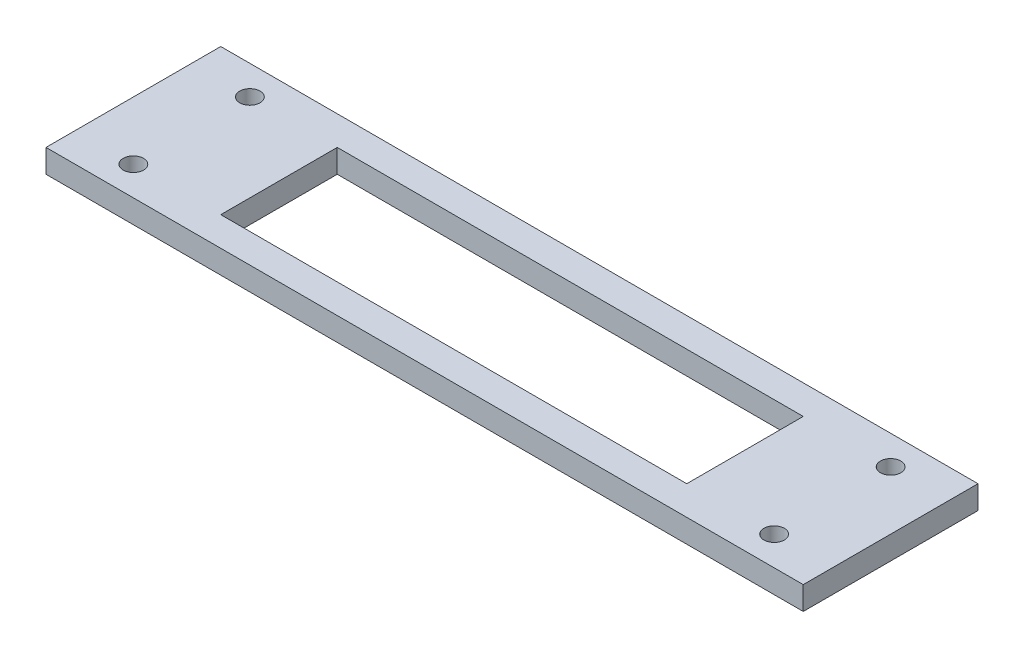
ISO-10303-21;
HEADER;
FILE_DESCRIPTION(('STEP AP214'),'2;1');
FILE_NAME('part.step','',(''),(''),'','','');
FILE_SCHEMA(('AUTOMOTIVE_DESIGN { 1 0 10303 214 1 1 1 1 }'));
ENDSEC;
DATA;
#1=APPLICATION_CONTEXT('core data for automotive mechanical design processes');
#2=APPLICATION_PROTOCOL_DEFINITION('international standard','automotive_design',2000,#1);
#3=PRODUCT_CONTEXT('',#1,'mechanical');
#4=PRODUCT('Part','Part','',(#3));
#5=PRODUCT_RELATED_PRODUCT_CATEGORY('part','',(#4));
#6=PRODUCT_DEFINITION_FORMATION('','',#4);
#7=PRODUCT_DEFINITION_CONTEXT('part definition',#1,'design');
#8=PRODUCT_DEFINITION('design','',#6,#7);
#9=PRODUCT_DEFINITION_SHAPE('','',#8);
#10=(LENGTH_UNIT() NAMED_UNIT(*) SI_UNIT(.MILLI.,.METRE.));
#11=(NAMED_UNIT(*) PLANE_ANGLE_UNIT() SI_UNIT($,.RADIAN.));
#12=(NAMED_UNIT(*) SI_UNIT($,.STERADIAN.) SOLID_ANGLE_UNIT());
#13=UNCERTAINTY_MEASURE_WITH_UNIT(LENGTH_MEASURE(1.E-05),#10,'distance_accuracy_value','');
#14=(GEOMETRIC_REPRESENTATION_CONTEXT(3) GLOBAL_UNCERTAINTY_ASSIGNED_CONTEXT((#13)) GLOBAL_UNIT_ASSIGNED_CONTEXT((#10,
#11,#12)) REPRESENTATION_CONTEXT('',''));
#15=CARTESIAN_POINT('',(0.,0.,0.));
#16=DIRECTION('',(0.,0.,1.));
#17=DIRECTION('',(1.,0.,0.));
#18=AXIS2_PLACEMENT_3D('',#15,#16,#17);
#19=CARTESIAN_POINT('',(0.,4.,0.));
#20=DIRECTION('',(-1.,0.,0.));
#21=DIRECTION('',(0.,0.,1.));
#22=AXIS2_PLACEMENT_3D('',#19,#20,#21);
#23=PLANE('',#22);
#24=DIRECTION('',(0.,0.,-1.));
#25=VECTOR('',#24,1.);
#26=CARTESIAN_POINT('',(0.,0.,0.));
#27=LINE('',#26,#25);
#28=CARTESIAN_POINT('',(0.,0.,0.));
#29=VERTEX_POINT('',#28);
#30=CARTESIAN_POINT('',(0.,0.,-30.));
#31=VERTEX_POINT('',#30);
#32=EDGE_CURVE('E133',#29,#31,#27,.T.);
#33=ORIENTED_EDGE('',*,*,#32,.F.);
#34=DIRECTION('',(0.,-1.,0.));
#35=VECTOR('',#34,1.);
#36=CARTESIAN_POINT('',(0.,4.,0.));
#37=LINE('',#36,#35);
#38=CARTESIAN_POINT('',(0.,4.,0.));
#39=VERTEX_POINT('',#38);
#40=EDGE_CURVE('E11',#39,#29,#37,.T.);
#41=ORIENTED_EDGE('',*,*,#40,.F.);
#42=DIRECTION('',(0.,0.,-1.));
#43=VECTOR('',#42,1.);
#44=CARTESIAN_POINT('',(0.,4.,0.));
#45=LINE('',#44,#43);
#46=CARTESIAN_POINT('',(0.,4.,-30.));
#47=VERTEX_POINT('',#46);
#48=EDGE_CURVE('E137',#39,#47,#45,.T.);
#49=ORIENTED_EDGE('',*,*,#48,.T.);
#50=DIRECTION('',(0.,-1.,0.));
#51=VECTOR('',#50,1.);
#52=CARTESIAN_POINT('',(0.,4.,-30.));
#53=LINE('',#52,#51);
#54=EDGE_CURVE('E160',#47,#31,#53,.T.);
#55=ORIENTED_EDGE('',*,*,#54,.T.);
#56=EDGE_LOOP('',(#33,#41,#49,#55));
#57=FACE_BOUND('',#56,.T.);
#58=ADVANCED_FACE('F37',(#57),#23,.T.);
#59=CARTESIAN_POINT('',(0.,4.,0.));
#60=DIRECTION('',(0.,0.,-1.));
#61=DIRECTION('',(-1.,0.,0.));
#62=AXIS2_PLACEMENT_3D('',#59,#60,#61);
#63=PLANE('',#62);
#64=DIRECTION('',(1.,0.,0.));
#65=VECTOR('',#64,1.);
#66=CARTESIAN_POINT('',(0.,0.,0.));
#67=LINE('',#66,#65);
#68=CARTESIAN_POINT('',(130.,0.,0.));
#69=VERTEX_POINT('',#68);
#70=EDGE_CURVE('E163',#29,#69,#67,.T.);
#71=ORIENTED_EDGE('',*,*,#70,.T.);
#72=DIRECTION('',(0.,-1.,0.));
#73=VECTOR('',#72,1.);
#74=CARTESIAN_POINT('',(130.,4.,0.));
#75=LINE('',#74,#73);
#76=CARTESIAN_POINT('',(130.,4.,0.));
#77=VERTEX_POINT('',#76);
#78=EDGE_CURVE('E44',#77,#69,#75,.T.);
#79=ORIENTED_EDGE('',*,*,#78,.F.);
#80=DIRECTION('',(1.,0.,0.));
#81=VECTOR('',#80,1.);
#82=CARTESIAN_POINT('',(0.,4.,0.));
#83=LINE('',#82,#81);
#84=EDGE_CURVE('E140',#39,#77,#83,.T.);
#85=ORIENTED_EDGE('',*,*,#84,.F.);
#86=ORIENTED_EDGE('',*,*,#40,.T.);
#87=EDGE_LOOP('',(#71,#79,#85,#86));
#88=FACE_BOUND('',#87,.T.);
#89=ADVANCED_FACE('F204',(#88),#63,.F.);
#90=CARTESIAN_POINT('',(130.,4.,0.));
#91=DIRECTION('',(-1.,0.,0.));
#92=DIRECTION('',(0.,0.,1.));
#93=AXIS2_PLACEMENT_3D('',#90,#91,#92);
#94=PLANE('',#93);
#95=DIRECTION('',(0.,0.,-1.));
#96=VECTOR('',#95,1.);
#97=CARTESIAN_POINT('',(130.,0.,0.));
#98=LINE('',#97,#96);
#99=CARTESIAN_POINT('',(130.,0.,-30.));
#100=VERTEX_POINT('',#99);
#101=EDGE_CURVE('E165',#69,#100,#98,.T.);
#102=ORIENTED_EDGE('',*,*,#101,.T.);
#103=DIRECTION('',(0.,-1.,0.));
#104=VECTOR('',#103,1.);
#105=CARTESIAN_POINT('',(130.,4.,-30.));
#106=LINE('',#105,#104);
#107=CARTESIAN_POINT('',(130.,4.,-30.));
#108=VERTEX_POINT('',#107);
#109=EDGE_CURVE('E183',#108,#100,#106,.T.);
#110=ORIENTED_EDGE('',*,*,#109,.F.);
#111=DIRECTION('',(0.,0.,-1.));
#112=VECTOR('',#111,1.);
#113=CARTESIAN_POINT('',(130.,4.,0.));
#114=LINE('',#113,#112);
#115=EDGE_CURVE('E143',#77,#108,#114,.T.);
#116=ORIENTED_EDGE('',*,*,#115,.F.);
#117=ORIENTED_EDGE('',*,*,#78,.T.);
#118=EDGE_LOOP('',(#102,#110,#116,#117));
#119=FACE_BOUND('',#118,.T.);
#120=ADVANCED_FACE('F189',(#119),#94,.F.);
#121=CARTESIAN_POINT('',(9.99999999999999,4.,-5.));
#122=DIRECTION('',(0.,-1.,0.));
#123=DIRECTION('',(0.,0.,-1.));
#124=AXIS2_PLACEMENT_3D('',#121,#122,#123);
#125=CYLINDRICAL_SURFACE('',#124,1.75000000000001);
#126=CARTESIAN_POINT('',(9.99999999999999,4.,-5.));
#127=DIRECTION('',(0.,1.,0.));
#128=DIRECTION('',(0.,0.,1.));
#129=AXIS2_PLACEMENT_3D('',#126,#127,#128);
#130=CIRCLE('',#129,1.75000000000001);
#131=CARTESIAN_POINT('',(9.99999999999999,4.,-3.24999999999999));
#132=VERTEX_POINT('',#131);
#133=EDGE_CURVE('E154',#132,#132,#130,.F.);
#134=ORIENTED_EDGE('',*,*,#133,.F.);
#135=EDGE_LOOP('',(#134));
#136=FACE_BOUND('',#135,.T.);
#137=CARTESIAN_POINT('',(9.99999999999999,0.,-5.));
#138=DIRECTION('',(0.,1.,0.));
#139=DIRECTION('',(0.,0.,1.));
#140=AXIS2_PLACEMENT_3D('',#137,#138,#139);
#141=CIRCLE('',#140,1.75000000000001);
#142=CARTESIAN_POINT('',(9.99999999999999,0.,-3.24999999999999));
#143=VERTEX_POINT('',#142);
#144=EDGE_CURVE('E177',#143,#143,#141,.F.);
#145=ORIENTED_EDGE('',*,*,#144,.T.);
#146=EDGE_LOOP('',(#145));
#147=FACE_BOUND('',#146,.T.);
#148=ADVANCED_FACE('F213',(#136,#147),#125,.F.);
#149=CARTESIAN_POINT('',(120.,4.,-25.));
#150=DIRECTION('',(0.,-1.,0.));
#151=DIRECTION('',(0.,0.,-1.));
#152=AXIS2_PLACEMENT_3D('',#149,#150,#151);
#153=CYLINDRICAL_SURFACE('',#152,1.75000000000001);
#154=CARTESIAN_POINT('',(120.,4.,-25.));
#155=DIRECTION('',(0.,1.,0.));
#156=DIRECTION('',(0.,0.,1.));
#157=AXIS2_PLACEMENT_3D('',#154,#155,#156);
#158=CIRCLE('',#157,1.75000000000001);
#159=CARTESIAN_POINT('',(120.,4.,-23.25));
#160=VERTEX_POINT('',#159);
#161=EDGE_CURVE('E151',#160,#160,#158,.T.);
#162=ORIENTED_EDGE('',*,*,#161,.T.);
#163=EDGE_LOOP('',(#162));
#164=FACE_BOUND('',#163,.T.);
#165=CARTESIAN_POINT('',(120.,0.,-25.));
#166=DIRECTION('',(0.,1.,0.));
#167=DIRECTION('',(0.,0.,1.));
#168=AXIS2_PLACEMENT_3D('',#165,#166,#167);
#169=CIRCLE('',#168,1.75000000000001);
#170=CARTESIAN_POINT('',(120.,0.,-23.25));
#171=VERTEX_POINT('',#170);
#172=EDGE_CURVE('E174',#171,#171,#169,.T.);
#173=ORIENTED_EDGE('',*,*,#172,.F.);
#174=EDGE_LOOP('',(#173));
#175=FACE_BOUND('',#174,.T.);
#176=ADVANCED_FACE('F222',(#164,#175),#153,.F.);
#177=CARTESIAN_POINT('',(9.99999999999999,4.,-25.));
#178=DIRECTION('',(0.,-1.,0.));
#179=DIRECTION('',(0.,0.,-1.));
#180=AXIS2_PLACEMENT_3D('',#177,#178,#179);
#181=CYLINDRICAL_SURFACE('',#180,1.75000000000001);
#182=CARTESIAN_POINT('',(9.99999999999999,4.,-25.));
#183=DIRECTION('',(0.,1.,0.));
#184=DIRECTION('',(0.,0.,1.));
#185=AXIS2_PLACEMENT_3D('',#182,#183,#184);
#186=CIRCLE('',#185,1.75000000000001);
#187=CARTESIAN_POINT('',(9.99999999999999,4.,-23.25));
#188=VERTEX_POINT('',#187);
#189=EDGE_CURVE('E148',#188,#188,#186,.F.);
#190=ORIENTED_EDGE('',*,*,#189,.F.);
#191=EDGE_LOOP('',(#190));
#192=FACE_BOUND('',#191,.T.);
#193=CARTESIAN_POINT('',(9.99999999999999,0.,-25.));
#194=DIRECTION('',(0.,1.,0.));
#195=DIRECTION('',(0.,0.,1.));
#196=AXIS2_PLACEMENT_3D('',#193,#194,#195);
#197=CIRCLE('',#196,1.75000000000001);
#198=CARTESIAN_POINT('',(9.99999999999999,0.,-23.25));
#199=VERTEX_POINT('',#198);
#200=EDGE_CURVE('E171',#199,#199,#197,.F.);
#201=ORIENTED_EDGE('',*,*,#200,.T.);
#202=EDGE_LOOP('',(#201));
#203=FACE_BOUND('',#202,.T.);
#204=ADVANCED_FACE('F219',(#192,#203),#181,.F.);
#205=CARTESIAN_POINT('',(0.,4.,-30.));
#206=DIRECTION('',(0.,0.,-1.));
#207=DIRECTION('',(-1.,0.,0.));
#208=AXIS2_PLACEMENT_3D('',#205,#206,#207);
#209=PLANE('',#208);
#210=DIRECTION('',(1.,0.,0.));
#211=VECTOR('',#210,1.);
#212=CARTESIAN_POINT('',(0.,0.,-30.));
#213=LINE('',#212,#211);
#214=EDGE_CURVE('E168',#31,#100,#213,.T.);
#215=ORIENTED_EDGE('',*,*,#214,.F.);
#216=ORIENTED_EDGE('',*,*,#54,.F.);
#217=DIRECTION('',(1.,0.,0.));
#218=VECTOR('',#217,1.);
#219=CARTESIAN_POINT('',(0.,4.,-30.));
#220=LINE('',#219,#218);
#221=EDGE_CURVE('E145',#47,#108,#220,.T.);
#222=ORIENTED_EDGE('',*,*,#221,.T.);
#223=ORIENTED_EDGE('',*,*,#109,.T.);
#224=EDGE_LOOP('',(#215,#216,#222,#223));
#225=FACE_BOUND('',#224,.T.);
#226=ADVANCED_FACE('F198',(#225),#209,.T.);
#227=CARTESIAN_POINT('',(120.,4.,-5.));
#228=DIRECTION('',(0.,-1.,0.));
#229=DIRECTION('',(0.,0.,-1.));
#230=AXIS2_PLACEMENT_3D('',#227,#228,#229);
#231=CYLINDRICAL_SURFACE('',#230,1.75000000000001);
#232=CARTESIAN_POINT('',(120.,4.,-5.));
#233=DIRECTION('',(0.,1.,0.));
#234=DIRECTION('',(0.,0.,1.));
#235=AXIS2_PLACEMENT_3D('',#232,#233,#234);
#236=CIRCLE('',#235,1.75000000000001);
#237=CARTESIAN_POINT('',(120.,4.,-3.24999999999999));
#238=VERTEX_POINT('',#237);
#239=EDGE_CURVE('E157',#238,#238,#236,.T.);
#240=ORIENTED_EDGE('',*,*,#239,.T.);
#241=EDGE_LOOP('',(#240));
#242=FACE_BOUND('',#241,.T.);
#243=CARTESIAN_POINT('',(120.,0.,-5.));
#244=DIRECTION('',(0.,1.,0.));
#245=DIRECTION('',(0.,0.,1.));
#246=AXIS2_PLACEMENT_3D('',#243,#244,#245);
#247=CIRCLE('',#246,1.75000000000001);
#248=CARTESIAN_POINT('',(120.,0.,-3.24999999999999));
#249=VERTEX_POINT('',#248);
#250=EDGE_CURVE('E141',#249,#249,#247,.T.);
#251=ORIENTED_EDGE('',*,*,#250,.F.);
#252=EDGE_LOOP('',(#251));
#253=FACE_BOUND('',#252,.T.);
#254=ADVANCED_FACE('F218',(#242,#253),#231,.F.);
#255=CARTESIAN_POINT('',(0.,4.,0.));
#256=DIRECTION('',(0.,1.,0.));
#257=DIRECTION('',(0.,0.,1.));
#258=AXIS2_PLACEMENT_3D('',#255,#256,#257);
#259=PLANE('',#258);
#260=DIRECTION('',(0.,0.,1.));
#261=VECTOR('',#260,1.);
#262=CARTESIAN_POINT('',(25.,4.,-25.));
#263=LINE('',#262,#261);
#264=CARTESIAN_POINT('',(25.,4.,-25.));
#265=VERTEX_POINT('',#264);
#266=CARTESIAN_POINT('',(25.,4.,-5.));
#267=VERTEX_POINT('',#266);
#268=EDGE_CURVE('E51',#265,#267,#263,.T.);
#269=ORIENTED_EDGE('',*,*,#268,.F.);
#270=DIRECTION('',(-1.,0.,0.));
#271=VECTOR('',#270,1.);
#272=CARTESIAN_POINT('',(25.,4.,-25.));
#273=LINE('',#272,#271);
#274=CARTESIAN_POINT('',(105.,4.,-25.));
#275=VERTEX_POINT('',#274);
#276=EDGE_CURVE('E118',#275,#265,#273,.T.);
#277=ORIENTED_EDGE('',*,*,#276,.F.);
#278=DIRECTION('',(0.,0.,-1.));
#279=VECTOR('',#278,1.);
#280=CARTESIAN_POINT('',(105.,4.,-25.));
#281=LINE('',#280,#279);
#282=CARTESIAN_POINT('',(105.,4.,-5.));
#283=VERTEX_POINT('',#282);
#284=EDGE_CURVE('E121',#283,#275,#281,.T.);
#285=ORIENTED_EDGE('',*,*,#284,.F.);
#286=DIRECTION('',(1.,0.,0.));
#287=VECTOR('',#286,1.);
#288=CARTESIAN_POINT('',(25.,4.,-5.));
#289=LINE('',#288,#287);
#290=EDGE_CURVE('E127',#267,#283,#289,.T.);
#291=ORIENTED_EDGE('',*,*,#290,.F.);
#292=EDGE_LOOP('',(#269,#277,#285,#291));
#293=FACE_BOUND('',#292,.T.);
#294=ORIENTED_EDGE('',*,*,#48,.F.);
#295=ORIENTED_EDGE('',*,*,#84,.T.);
#296=ORIENTED_EDGE('',*,*,#115,.T.);
#297=ORIENTED_EDGE('',*,*,#221,.F.);
#298=EDGE_LOOP('',(#294,#295,#296,#297));
#299=FACE_BOUND('',#298,.T.);
#300=ORIENTED_EDGE('',*,*,#189,.T.);
#301=EDGE_LOOP('',(#300));
#302=FACE_BOUND('',#301,.T.);
#303=ORIENTED_EDGE('',*,*,#161,.F.);
#304=EDGE_LOOP('',(#303));
#305=FACE_BOUND('',#304,.T.);
#306=ORIENTED_EDGE('',*,*,#133,.T.);
#307=EDGE_LOOP('',(#306));
#308=FACE_BOUND('',#307,.T.);
#309=ORIENTED_EDGE('',*,*,#239,.F.);
#310=EDGE_LOOP('',(#309));
#311=FACE_BOUND('',#310,.T.);
#312=ADVANCED_FACE('F202',(#293,#299,#302,#305,#308,#311),#259,.T.);
#313=CARTESIAN_POINT('',(0.,0.,0.));
#314=DIRECTION('',(0.,1.,0.));
#315=DIRECTION('',(0.,0.,1.));
#316=AXIS2_PLACEMENT_3D('',#313,#314,#315);
#317=PLANE('',#316);
#318=DIRECTION('',(-1.,0.,0.));
#319=VECTOR('',#318,1.);
#320=CARTESIAN_POINT('',(25.,0.,-25.));
#321=LINE('',#320,#319);
#322=CARTESIAN_POINT('',(105.,0.,-25.));
#323=VERTEX_POINT('',#322);
#324=CARTESIAN_POINT('',(25.,0.,-25.));
#325=VERTEX_POINT('',#324);
#326=EDGE_CURVE('E108',#323,#325,#321,.T.);
#327=ORIENTED_EDGE('',*,*,#326,.T.);
#328=DIRECTION('',(0.,0.,1.));
#329=VECTOR('',#328,1.);
#330=CARTESIAN_POINT('',(25.,0.,-25.));
#331=LINE('',#330,#329);
#332=CARTESIAN_POINT('',(25.,0.,-5.));
#333=VERTEX_POINT('',#332);
#334=EDGE_CURVE('E102',#325,#333,#331,.T.);
#335=ORIENTED_EDGE('',*,*,#334,.T.);
#336=DIRECTION('',(1.,0.,0.));
#337=VECTOR('',#336,1.);
#338=CARTESIAN_POINT('',(25.,0.,-5.));
#339=LINE('',#338,#337);
#340=CARTESIAN_POINT('',(105.,0.,-5.));
#341=VERTEX_POINT('',#340);
#342=EDGE_CURVE('E111',#333,#341,#339,.T.);
#343=ORIENTED_EDGE('',*,*,#342,.T.);
#344=DIRECTION('',(0.,0.,-1.));
#345=VECTOR('',#344,1.);
#346=CARTESIAN_POINT('',(105.,0.,-25.));
#347=LINE('',#346,#345);
#348=EDGE_CURVE('E59',#341,#323,#347,.T.);
#349=ORIENTED_EDGE('',*,*,#348,.T.);
#350=EDGE_LOOP('',(#327,#335,#343,#349));
#351=FACE_BOUND('',#350,.T.);
#352=ORIENTED_EDGE('',*,*,#32,.T.);
#353=ORIENTED_EDGE('',*,*,#214,.T.);
#354=ORIENTED_EDGE('',*,*,#101,.F.);
#355=ORIENTED_EDGE('',*,*,#70,.F.);
#356=EDGE_LOOP('',(#352,#353,#354,#355));
#357=FACE_BOUND('',#356,.T.);
#358=ORIENTED_EDGE('',*,*,#200,.F.);
#359=EDGE_LOOP('',(#358));
#360=FACE_BOUND('',#359,.T.);
#361=ORIENTED_EDGE('',*,*,#172,.T.);
#362=EDGE_LOOP('',(#361));
#363=FACE_BOUND('',#362,.T.);
#364=ORIENTED_EDGE('',*,*,#144,.F.);
#365=EDGE_LOOP('',(#364));
#366=FACE_BOUND('',#365,.T.);
#367=ORIENTED_EDGE('',*,*,#250,.T.);
#368=EDGE_LOOP('',(#367));
#369=FACE_BOUND('',#368,.T.);
#370=ADVANCED_FACE('F115',(#351,#357,#360,#363,#366,#369),#317,.F.);
#371=CARTESIAN_POINT('',(25.,0.,-25.));
#372=DIRECTION('',(-1.,0.,0.));
#373=DIRECTION('',(0.,0.,1.));
#374=AXIS2_PLACEMENT_3D('',#371,#372,#373);
#375=PLANE('',#374);
#376=ORIENTED_EDGE('',*,*,#268,.T.);
#377=DIRECTION('',(0.,1.,0.));
#378=VECTOR('',#377,1.);
#379=CARTESIAN_POINT('',(25.,0.,-5.));
#380=LINE('',#379,#378);
#381=EDGE_CURVE('E98',#333,#267,#380,.T.);
#382=ORIENTED_EDGE('',*,*,#381,.F.);
#383=ORIENTED_EDGE('',*,*,#334,.F.);
#384=DIRECTION('',(0.,1.,0.));
#385=VECTOR('',#384,1.);
#386=CARTESIAN_POINT('',(25.,0.,-25.));
#387=LINE('',#386,#385);
#388=EDGE_CURVE('E131',#325,#265,#387,.T.);
#389=ORIENTED_EDGE('',*,*,#388,.T.);
#390=EDGE_LOOP('',(#376,#382,#383,#389));
#391=FACE_BOUND('',#390,.T.);
#392=ADVANCED_FACE('F100',(#391),#375,.F.);
#393=CARTESIAN_POINT('',(25.,0.,-25.));
#394=DIRECTION('',(0.,0.,-1.));
#395=DIRECTION('',(-1.,0.,0.));
#396=AXIS2_PLACEMENT_3D('',#393,#394,#395);
#397=PLANE('',#396);
#398=ORIENTED_EDGE('',*,*,#276,.T.);
#399=ORIENTED_EDGE('',*,*,#388,.F.);
#400=ORIENTED_EDGE('',*,*,#326,.F.);
#401=DIRECTION('',(0.,1.,0.));
#402=VECTOR('',#401,1.);
#403=CARTESIAN_POINT('',(105.,0.,-25.));
#404=LINE('',#403,#402);
#405=EDGE_CURVE('E134',#323,#275,#404,.T.);
#406=ORIENTED_EDGE('',*,*,#405,.T.);
#407=EDGE_LOOP('',(#398,#399,#400,#406));
#408=FACE_BOUND('',#407,.T.);
#409=ADVANCED_FACE('F240',(#408),#397,.F.);
#410=CARTESIAN_POINT('',(105.,0.,-25.));
#411=DIRECTION('',(1.,0.,0.));
#412=DIRECTION('',(0.,0.,-1.));
#413=AXIS2_PLACEMENT_3D('',#410,#411,#412);
#414=PLANE('',#413);
#415=ORIENTED_EDGE('',*,*,#284,.T.);
#416=ORIENTED_EDGE('',*,*,#405,.F.);
#417=ORIENTED_EDGE('',*,*,#348,.F.);
#418=DIRECTION('',(0.,1.,0.));
#419=VECTOR('',#418,1.);
#420=CARTESIAN_POINT('',(105.,0.,-5.));
#421=LINE('',#420,#419);
#422=EDGE_CURVE('E107',#341,#283,#421,.T.);
#423=ORIENTED_EDGE('',*,*,#422,.T.);
#424=EDGE_LOOP('',(#415,#416,#417,#423));
#425=FACE_BOUND('',#424,.T.);
#426=ADVANCED_FACE('F243',(#425),#414,.F.);
#427=CARTESIAN_POINT('',(25.,0.,-5.));
#428=DIRECTION('',(0.,0.,1.));
#429=DIRECTION('',(1.,0.,0.));
#430=AXIS2_PLACEMENT_3D('',#427,#428,#429);
#431=PLANE('',#430);
#432=ORIENTED_EDGE('',*,*,#290,.T.);
#433=ORIENTED_EDGE('',*,*,#422,.F.);
#434=ORIENTED_EDGE('',*,*,#342,.F.);
#435=ORIENTED_EDGE('',*,*,#381,.T.);
#436=EDGE_LOOP('',(#432,#433,#434,#435));
#437=FACE_BOUND('',#436,.T.);
#438=ADVANCED_FACE('F112',(#437),#431,.F.);
#439=CLOSED_SHELL('',(#58,#89,#120,#148,#176,#204,#226,#254,#312,#370,#392,#409,#426,#438));
#440=MANIFOLD_SOLID_BREP('B2',#439);
#441=ADVANCED_BREP_SHAPE_REPRESENTATION('',(#18,#440),#14);
#442=SHAPE_DEFINITION_REPRESENTATION(#9,#441);
ENDSEC;
END-ISO-10303-21;
